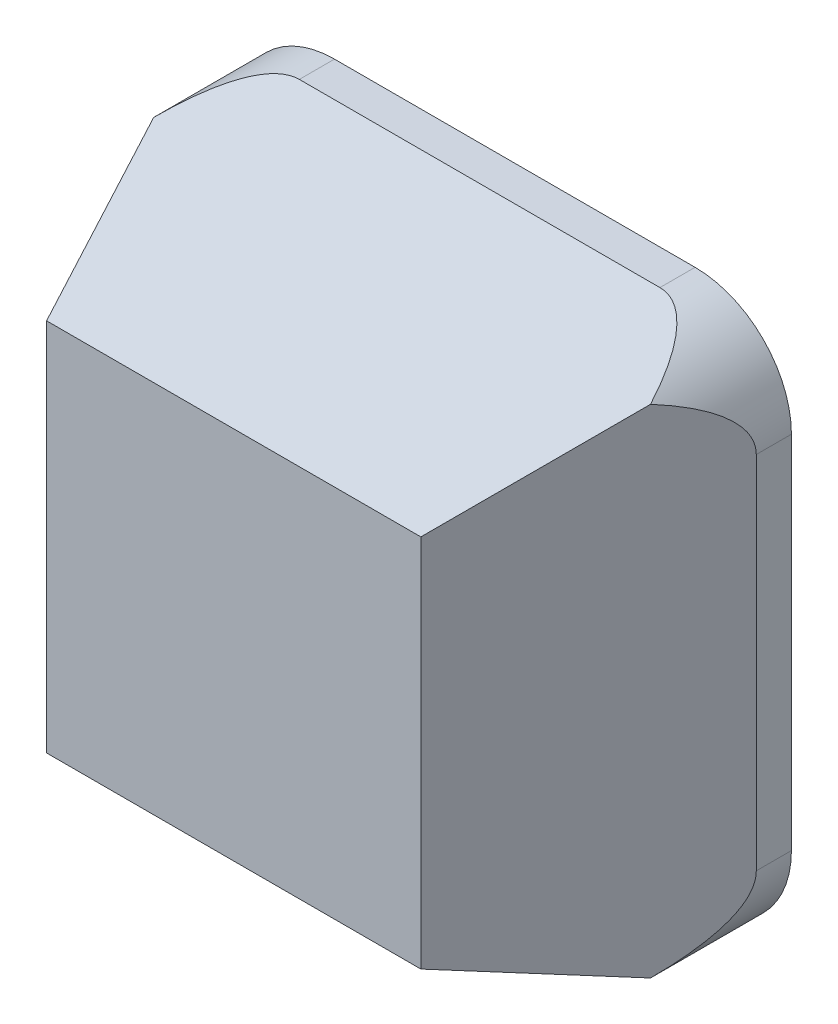
ISO-10303-21;
HEADER;
FILE_DESCRIPTION(('STEP AP214'),'2;1');
FILE_NAME('part.step','',(''),(''),'','','');
FILE_SCHEMA(('AUTOMOTIVE_DESIGN { 1 0 10303 214 1 1 1 1 }'));
ENDSEC;
DATA;
#1=APPLICATION_CONTEXT('core data for automotive mechanical design processes');
#2=APPLICATION_PROTOCOL_DEFINITION('international standard','automotive_design',2000,#1);
#3=PRODUCT_CONTEXT('',#1,'mechanical');
#4=PRODUCT('Part','Part','',(#3));
#5=PRODUCT_RELATED_PRODUCT_CATEGORY('part','',(#4));
#6=PRODUCT_DEFINITION_FORMATION('','',#4);
#7=PRODUCT_DEFINITION_CONTEXT('part definition',#1,'design');
#8=PRODUCT_DEFINITION('design','',#6,#7);
#9=PRODUCT_DEFINITION_SHAPE('','',#8);
#10=(LENGTH_UNIT() NAMED_UNIT(*) SI_UNIT(.MILLI.,.METRE.));
#11=(NAMED_UNIT(*) PLANE_ANGLE_UNIT() SI_UNIT($,.RADIAN.));
#12=(NAMED_UNIT(*) SI_UNIT($,.STERADIAN.) SOLID_ANGLE_UNIT());
#13=UNCERTAINTY_MEASURE_WITH_UNIT(LENGTH_MEASURE(1.E-05),#10,'distance_accuracy_value','');
#14=(GEOMETRIC_REPRESENTATION_CONTEXT(3) GLOBAL_UNCERTAINTY_ASSIGNED_CONTEXT((#13)) GLOBAL_UNIT_ASSIGNED_CONTEXT((#10,
#11,#12)) REPRESENTATION_CONTEXT('',''));
#15=CARTESIAN_POINT('',(0.,0.,0.));
#16=DIRECTION('',(0.,0.,1.));
#17=DIRECTION('',(1.,0.,0.));
#18=AXIS2_PLACEMENT_3D('',#15,#16,#17);
#19=CARTESIAN_POINT('',(8.14635413914787,8.14635413914787,12.7));
#20=DIRECTION('',(0.,0.,-1.));
#21=DIRECTION('',(-1.,0.,0.));
#22=AXIS2_PLACEMENT_3D('',#19,#20,#21);
#23=CYLINDRICAL_SURFACE('',#22,4.35431549252289);
#24=CARTESIAN_POINT('',(8.14635413914787,8.14635413914787,13.5508834928882));
#25=DIRECTION('',(0.,0.939692620785909,0.342020143325666));
#26=DIRECTION('',(0.,0.342020143325666,-0.939692620785909));
#27=AXIS2_PLACEMENT_3D('',#24,#25,#26);
#28=ELLIPSE('',#27,12.7311667967368,4.35431549252289);
#29=CARTESIAN_POINT('',(11.2253201513342,11.2253201513387,5.09149389912564));
#30=VERTEX_POINT('',#29);
#31=CARTESIAN_POINT('',(8.14635413914787,12.5006696316708,1.5875));
#32=VERTEX_POINT('',#31);
#33=EDGE_CURVE('E214',#30,#32,#28,.T.);
#34=ORIENTED_EDGE('',*,*,#33,.F.);
#35=CARTESIAN_POINT('',(8.14635413914787,8.14635413914787,13.5508834928718));
#36=DIRECTION('',(-0.939692620785854,0.,-0.342020143325818));
#37=DIRECTION('',(0.342020143325818,0.,-0.939692620785854));
#38=AXIS2_PLACEMENT_3D('',#35,#36,#37);
#39=ELLIPSE('',#38,12.7311667967312,4.35431549252289);
#40=CARTESIAN_POINT('',(12.500669631667,8.14635413914787,1.58749999999998));
#41=VERTEX_POINT('',#40);
#42=EDGE_CURVE('E237',#30,#41,#39,.T.);
#43=ORIENTED_EDGE('',*,*,#42,.T.);
#44=DIRECTION('',(0.,0.,-1.));
#45=VECTOR('',#44,1.);
#46=CARTESIAN_POINT('',(12.5006696316708,8.14635413914787,12.7));
#47=LINE('',#46,#45);
#48=CARTESIAN_POINT('',(12.5006696316708,8.14635413914787,0.));
#49=VERTEX_POINT('',#48);
#50=EDGE_CURVE('E135',#41,#49,#47,.T.);
#51=ORIENTED_EDGE('',*,*,#50,.T.);
#52=CARTESIAN_POINT('',(8.14635413914787,8.14635413914787,0.));
#53=DIRECTION('',(0.,0.,1.));
#54=DIRECTION('',(1.,0.,0.));
#55=AXIS2_PLACEMENT_3D('',#52,#53,#54);
#56=CIRCLE('',#55,4.35431549252289);
#57=CARTESIAN_POINT('',(8.14635413914787,12.5006696316708,0.));
#58=VERTEX_POINT('',#57);
#59=EDGE_CURVE('E196',#49,#58,#56,.T.);
#60=ORIENTED_EDGE('',*,*,#59,.T.);
#61=DIRECTION('',(0.,0.,-1.));
#62=VECTOR('',#61,1.);
#63=CARTESIAN_POINT('',(8.14635413914787,12.5006696316708,12.7));
#64=LINE('',#63,#62);
#65=EDGE_CURVE('E145',#32,#58,#64,.T.);
#66=ORIENTED_EDGE('',*,*,#65,.F.);
#67=EDGE_LOOP('',(#34,#43,#51,#60,#66));
#68=FACE_BOUND('',#67,.T.);
#69=ADVANCED_FACE('F33',(#68),#23,.T.);
#70=CARTESIAN_POINT('',(0.,12.5006696316708,12.7));
#71=DIRECTION('',(0.,-1.,0.));
#72=DIRECTION('',(1.,0.,0.));
#73=AXIS2_PLACEMENT_3D('',#70,#71,#72);
#74=PLANE('',#73);
#75=DIRECTION('',(1.,0.,0.));
#76=VECTOR('',#75,1.);
#77=CARTESIAN_POINT('',(-25.4,12.5006696316708,1.5875));
#78=LINE('',#77,#76);
#79=CARTESIAN_POINT('',(-8.14635413914787,12.5006696316708,1.5875));
#80=VERTEX_POINT('',#79);
#81=EDGE_CURVE('E192',#80,#32,#78,.T.);
#82=ORIENTED_EDGE('',*,*,#81,.T.);
#83=ORIENTED_EDGE('',*,*,#65,.T.);
#84=DIRECTION('',(-1.,0.,0.));
#85=VECTOR('',#84,1.);
#86=CARTESIAN_POINT('',(0.,12.5006696316708,0.));
#87=LINE('',#86,#85);
#88=CARTESIAN_POINT('',(-8.14635413914787,12.5006696316708,0.));
#89=VERTEX_POINT('',#88);
#90=EDGE_CURVE('E190',#58,#89,#87,.T.);
#91=ORIENTED_EDGE('',*,*,#90,.T.);
#92=DIRECTION('',(0.,0.,-1.));
#93=VECTOR('',#92,1.);
#94=CARTESIAN_POINT('',(-8.14635413914787,12.5006696316708,12.7));
#95=LINE('',#94,#93);
#96=EDGE_CURVE('E181',#80,#89,#95,.T.);
#97=ORIENTED_EDGE('',*,*,#96,.F.);
#98=EDGE_LOOP('',(#82,#83,#91,#97));
#99=FACE_BOUND('',#98,.T.);
#100=ADVANCED_FACE('F187',(#99),#74,.F.);
#101=CARTESIAN_POINT('',(-8.14635413914787,8.14635413914787,12.7));
#102=DIRECTION('',(0.,0.,-1.));
#103=DIRECTION('',(-1.,0.,0.));
#104=AXIS2_PLACEMENT_3D('',#101,#102,#103);
#105=CYLINDRICAL_SURFACE('',#104,4.35431549252289);
#106=DIRECTION('',(0.,0.,-1.));
#107=VECTOR('',#106,1.);
#108=CARTESIAN_POINT('',(-12.5006696316708,8.14635413914787,12.7));
#109=LINE('',#108,#107);
#110=CARTESIAN_POINT('',(-12.500669631667,8.14635413914787,1.58749999999998));
#111=VERTEX_POINT('',#110);
#112=CARTESIAN_POINT('',(-12.5006696316708,8.14635413914787,0.));
#113=VERTEX_POINT('',#112);
#114=EDGE_CURVE('E174',#111,#113,#109,.T.);
#115=ORIENTED_EDGE('',*,*,#114,.F.);
#116=CARTESIAN_POINT('',(-8.14635413914787,8.14635413914787,13.5508834928718));
#117=DIRECTION('',(0.939692620785855,0.,-0.342020143325817));
#118=DIRECTION('',(-0.342020143325817,0.,-0.939692620785854));
#119=AXIS2_PLACEMENT_3D('',#116,#117,#118);
#120=ELLIPSE('',#119,12.7311667967312,4.35431549252289);
#121=CARTESIAN_POINT('',(-11.2253201513342,11.2253201513387,5.09149389912566));
#122=VERTEX_POINT('',#121);
#123=EDGE_CURVE('E227',#111,#122,#120,.T.);
#124=ORIENTED_EDGE('',*,*,#123,.T.);
#125=CARTESIAN_POINT('',(-8.14635413914787,8.14635413914787,13.5508834928882));
#126=DIRECTION('',(0.,0.939692620785909,0.342020143325666));
#127=DIRECTION('',(0.,0.342020143325666,-0.939692620785909));
#128=AXIS2_PLACEMENT_3D('',#125,#126,#127);
#129=ELLIPSE('',#128,12.7311667967368,4.35431549252289);
#130=EDGE_CURVE('E217',#80,#122,#129,.T.);
#131=ORIENTED_EDGE('',*,*,#130,.F.);
#132=ORIENTED_EDGE('',*,*,#96,.T.);
#133=CARTESIAN_POINT('',(-8.14635413914787,8.14635413914787,0.));
#134=DIRECTION('',(0.,0.,1.));
#135=DIRECTION('',(1.,0.,0.));
#136=AXIS2_PLACEMENT_3D('',#133,#134,#135);
#137=CIRCLE('',#136,4.35431549252289);
#138=EDGE_CURVE('E203',#89,#113,#137,.T.);
#139=ORIENTED_EDGE('',*,*,#138,.T.);
#140=EDGE_LOOP('',(#115,#124,#131,#132,#139));
#141=FACE_BOUND('',#140,.T.);
#142=ADVANCED_FACE('F251',(#141),#105,.T.);
#143=CARTESIAN_POINT('',(0.,0.,12.7));
#144=DIRECTION('',(0.,0.,1.));
#145=DIRECTION('',(1.,0.,0.));
#146=AXIS2_PLACEMENT_3D('',#143,#144,#145);
#147=PLANE('',#146);
#148=DIRECTION('',(0.,1.,0.));
#149=VECTOR('',#148,1.);
#150=CARTESIAN_POINT('',(8.4560504033818,-25.4,12.7));
#151=LINE('',#150,#149);
#152=CARTESIAN_POINT('',(8.4560504033818,-8.45605040338761,12.7));
#153=VERTEX_POINT('',#152);
#154=CARTESIAN_POINT('',(8.45605040338179,8.45605040338761,12.7));
#155=VERTEX_POINT('',#154);
#156=EDGE_CURVE('E48',#153,#155,#151,.T.);
#157=ORIENTED_EDGE('',*,*,#156,.T.);
#158=DIRECTION('',(-1.,0.,0.));
#159=VECTOR('',#158,1.);
#160=CARTESIAN_POINT('',(0.,8.45605040338762,12.7));
#161=LINE('',#160,#159);
#162=CARTESIAN_POINT('',(-8.45605040338181,8.45605040338761,12.7));
#163=VERTEX_POINT('',#162);
#164=EDGE_CURVE('E143',#155,#163,#161,.T.);
#165=ORIENTED_EDGE('',*,*,#164,.T.);
#166=DIRECTION('',(0.,1.,0.));
#167=VECTOR('',#166,1.);
#168=CARTESIAN_POINT('',(-8.45605040338181,-25.4,12.7));
#169=LINE('',#168,#167);
#170=CARTESIAN_POINT('',(-8.45605040338181,-8.45605040338761,12.7));
#171=VERTEX_POINT('',#170);
#172=EDGE_CURVE('E235',#171,#163,#169,.T.);
#173=ORIENTED_EDGE('',*,*,#172,.F.);
#174=DIRECTION('',(1.,0.,0.));
#175=VECTOR('',#174,1.);
#176=CARTESIAN_POINT('',(-25.4,-8.45605040338761,12.7));
#177=LINE('',#176,#175);
#178=EDGE_CURVE('E158',#171,#153,#177,.T.);
#179=ORIENTED_EDGE('',*,*,#178,.T.);
#180=EDGE_LOOP('',(#157,#165,#173,#179));
#181=FACE_BOUND('',#180,.T.);
#182=ADVANCED_FACE('F243',(#181),#147,.T.);
#183=CARTESIAN_POINT('',(0.,-12.5006696316708,12.7));
#184=DIRECTION('',(0.,1.,0.));
#185=DIRECTION('',(-1.,0.,0.));
#186=AXIS2_PLACEMENT_3D('',#183,#184,#185);
#187=PLANE('',#186);
#188=DIRECTION('',(0.,0.,-1.));
#189=VECTOR('',#188,1.);
#190=CARTESIAN_POINT('',(8.14635413914787,-12.5006696316707,12.7));
#191=LINE('',#190,#189);
#192=CARTESIAN_POINT('',(8.14635413914787,-12.5006696316708,1.58749999999998));
#193=VERTEX_POINT('',#192);
#194=CARTESIAN_POINT('',(8.14635413914787,-12.5006696316707,0.));
#195=VERTEX_POINT('',#194);
#196=EDGE_CURVE('E141',#193,#195,#191,.T.);
#197=ORIENTED_EDGE('',*,*,#196,.F.);
#198=DIRECTION('',(1.,0.,0.));
#199=VECTOR('',#198,1.);
#200=CARTESIAN_POINT('',(-25.4,-12.5006696316707,1.5875));
#201=LINE('',#200,#199);
#202=CARTESIAN_POINT('',(-8.14635413914786,-12.5006696316707,1.58749999999999));
#203=VERTEX_POINT('',#202);
#204=EDGE_CURVE('E225',#203,#193,#201,.T.);
#205=ORIENTED_EDGE('',*,*,#204,.F.);
#206=DIRECTION('',(0.,0.,-1.));
#207=VECTOR('',#206,1.);
#208=CARTESIAN_POINT('',(-8.14635413914787,-12.5006696316708,12.7));
#209=LINE('',#208,#207);
#210=CARTESIAN_POINT('',(-8.14635413914787,-12.5006696316708,0.));
#211=VERTEX_POINT('',#210);
#212=EDGE_CURVE('E166',#203,#211,#209,.T.);
#213=ORIENTED_EDGE('',*,*,#212,.T.);
#214=DIRECTION('',(1.,0.,0.));
#215=VECTOR('',#214,1.);
#216=CARTESIAN_POINT('',(0.,-12.5006696316708,0.));
#217=LINE('',#216,#215);
#218=EDGE_CURVE('E212',#211,#195,#217,.T.);
#219=ORIENTED_EDGE('',*,*,#218,.T.);
#220=EDGE_LOOP('',(#197,#205,#213,#219));
#221=FACE_BOUND('',#220,.T.);
#222=ADVANCED_FACE('F35',(#221),#187,.F.);
#223=CARTESIAN_POINT('',(8.14635413914787,-8.14635413914787,12.7));
#224=DIRECTION('',(0.,0.,-1.));
#225=DIRECTION('',(-1.,0.,0.));
#226=AXIS2_PLACEMENT_3D('',#223,#224,#225);
#227=CYLINDRICAL_SURFACE('',#226,4.35431549252289);
#228=DIRECTION('',(0.,0.,-1.));
#229=VECTOR('',#228,1.);
#230=CARTESIAN_POINT('',(12.5006696316708,-8.14635413914787,12.7));
#231=LINE('',#230,#229);
#232=CARTESIAN_POINT('',(12.500669631667,-8.14635413914787,1.58749999999998));
#233=VERTEX_POINT('',#232);
#234=CARTESIAN_POINT('',(12.5006696316708,-8.14635413914787,0.));
#235=VERTEX_POINT('',#234);
#236=EDGE_CURVE('E133',#233,#235,#231,.T.);
#237=ORIENTED_EDGE('',*,*,#236,.F.);
#238=CARTESIAN_POINT('',(8.14635413914787,-8.14635413914787,13.5508834928718));
#239=DIRECTION('',(-0.939692620785854,0.,-0.342020143325818));
#240=DIRECTION('',(0.342020143325818,0.,-0.939692620785854));
#241=AXIS2_PLACEMENT_3D('',#238,#239,#240);
#242=ELLIPSE('',#241,12.7311667967312,4.35431549252289);
#243=CARTESIAN_POINT('',(11.2253201513342,-11.2253201513387,5.09149389912564));
#244=VERTEX_POINT('',#243);
#245=EDGE_CURVE('E119',#233,#244,#242,.T.);
#246=ORIENTED_EDGE('',*,*,#245,.T.);
#247=CARTESIAN_POINT('',(8.14635413914787,-8.14635413914787,13.5508834928882));
#248=DIRECTION('',(0.,0.939692620785909,-0.342020143325666));
#249=DIRECTION('',(0.,-0.342020143325666,-0.93969262078591));
#250=AXIS2_PLACEMENT_3D('',#247,#248,#249);
#251=ELLIPSE('',#250,12.7311667967368,4.35431549252289);
#252=EDGE_CURVE('E223',#244,#193,#251,.T.);
#253=ORIENTED_EDGE('',*,*,#252,.T.);
#254=ORIENTED_EDGE('',*,*,#196,.T.);
#255=CARTESIAN_POINT('',(8.14635413914787,-8.14635413914787,0.));
#256=DIRECTION('',(0.,0.,1.));
#257=DIRECTION('',(1.,0.,0.));
#258=AXIS2_PLACEMENT_3D('',#255,#256,#257);
#259=CIRCLE('',#258,4.35431549252289);
#260=EDGE_CURVE('E139',#195,#235,#259,.T.);
#261=ORIENTED_EDGE('',*,*,#260,.T.);
#262=EDGE_LOOP('',(#237,#246,#253,#254,#261));
#263=FACE_BOUND('',#262,.T.);
#264=ADVANCED_FACE('F137',(#263),#227,.T.);
#265=CARTESIAN_POINT('',(12.5006696316708,0.,12.7));
#266=DIRECTION('',(-1.,0.,0.));
#267=DIRECTION('',(0.,-1.,0.));
#268=AXIS2_PLACEMENT_3D('',#265,#266,#267);
#269=PLANE('',#268);
#270=ORIENTED_EDGE('',*,*,#50,.F.);
#271=DIRECTION('',(0.,1.,0.));
#272=VECTOR('',#271,1.);
#273=CARTESIAN_POINT('',(12.500669631667,-25.4,1.58749999999998));
#274=LINE('',#273,#272);
#275=EDGE_CURVE('E122',#233,#41,#274,.T.);
#276=ORIENTED_EDGE('',*,*,#275,.F.);
#277=ORIENTED_EDGE('',*,*,#236,.T.);
#278=DIRECTION('',(0.,1.,0.));
#279=VECTOR('',#278,1.);
#280=CARTESIAN_POINT('',(12.5006696316708,0.,0.));
#281=LINE('',#280,#279);
#282=EDGE_CURVE('E198',#235,#49,#281,.T.);
#283=ORIENTED_EDGE('',*,*,#282,.T.);
#284=EDGE_LOOP('',(#270,#276,#277,#283));
#285=FACE_BOUND('',#284,.T.);
#286=ADVANCED_FACE('F131',(#285),#269,.F.);
#287=CARTESIAN_POINT('',(-12.5006696316708,0.,12.7));
#288=DIRECTION('',(1.,0.,0.));
#289=DIRECTION('',(0.,1.,0.));
#290=AXIS2_PLACEMENT_3D('',#287,#288,#289);
#291=PLANE('',#290);
#292=DIRECTION('',(0.,0.,-1.));
#293=VECTOR('',#292,1.);
#294=CARTESIAN_POINT('',(-12.5006696316707,-8.14635413914787,12.7));
#295=LINE('',#294,#293);
#296=CARTESIAN_POINT('',(-12.5006696316707,-8.14635413914787,1.58749999998961));
#297=VERTEX_POINT('',#296);
#298=CARTESIAN_POINT('',(-12.5006696316707,-8.14635413914787,0.));
#299=VERTEX_POINT('',#298);
#300=EDGE_CURVE('E172',#297,#299,#295,.T.);
#301=ORIENTED_EDGE('',*,*,#300,.F.);
#302=DIRECTION('',(0.,1.,0.));
#303=VECTOR('',#302,1.);
#304=CARTESIAN_POINT('',(-12.500669631667,-25.4,1.58749999999998));
#305=LINE('',#304,#303);
#306=EDGE_CURVE('E234',#297,#111,#305,.T.);
#307=ORIENTED_EDGE('',*,*,#306,.T.);
#308=ORIENTED_EDGE('',*,*,#114,.T.);
#309=DIRECTION('',(0.,-1.,0.));
#310=VECTOR('',#309,1.);
#311=CARTESIAN_POINT('',(-12.5006696316708,0.,0.));
#312=LINE('',#311,#310);
#313=EDGE_CURVE('E176',#113,#299,#312,.T.);
#314=ORIENTED_EDGE('',*,*,#313,.T.);
#315=EDGE_LOOP('',(#301,#307,#308,#314));
#316=FACE_BOUND('',#315,.T.);
#317=ADVANCED_FACE('F209',(#316),#291,.F.);
#318=CARTESIAN_POINT('',(-8.14635413914786,-8.14635413914787,12.7));
#319=DIRECTION('',(0.,0.,-1.));
#320=DIRECTION('',(-1.,0.,0.));
#321=AXIS2_PLACEMENT_3D('',#318,#319,#320);
#322=CYLINDRICAL_SURFACE('',#321,4.35431549252288);
#323=CARTESIAN_POINT('',(-8.14635413914786,-8.14635413914787,13.5508834928882));
#324=DIRECTION('',(0.,0.939692620785909,-0.342020143325666));
#325=DIRECTION('',(0.,-0.342020143325666,-0.93969262078591));
#326=AXIS2_PLACEMENT_3D('',#323,#324,#325);
#327=ELLIPSE('',#326,12.7311667967368,4.35431549252288);
#328=CARTESIAN_POINT('',(-11.2253201513342,-11.2253201513386,5.09149389912567));
#329=VERTEX_POINT('',#328);
#330=EDGE_CURVE('E150',#203,#329,#327,.T.);
#331=ORIENTED_EDGE('',*,*,#330,.T.);
#332=CARTESIAN_POINT('',(-8.14635413914786,-8.14635413914787,13.5508834928718));
#333=DIRECTION('',(0.939692620785855,0.,-0.342020143325817));
#334=DIRECTION('',(-0.342020143325817,0.,-0.939692620785854));
#335=AXIS2_PLACEMENT_3D('',#332,#333,#334);
#336=ELLIPSE('',#335,12.7311667967312,4.35431549252288);
#337=EDGE_CURVE('E55',#329,#297,#336,.T.);
#338=ORIENTED_EDGE('',*,*,#337,.T.);
#339=ORIENTED_EDGE('',*,*,#300,.T.);
#340=CARTESIAN_POINT('',(-8.14635413914786,-8.14635413914787,0.));
#341=DIRECTION('',(0.,0.,1.));
#342=DIRECTION('',(1.,0.,0.));
#343=AXIS2_PLACEMENT_3D('',#340,#341,#342);
#344=CIRCLE('',#343,4.35431549252288);
#345=EDGE_CURVE('E168',#299,#211,#344,.T.);
#346=ORIENTED_EDGE('',*,*,#345,.T.);
#347=ORIENTED_EDGE('',*,*,#212,.F.);
#348=EDGE_LOOP('',(#331,#338,#339,#346,#347));
#349=FACE_BOUND('',#348,.T.);
#350=ADVANCED_FACE('F163',(#349),#322,.T.);
#351=CARTESIAN_POINT('',(0.,0.,0.));
#352=DIRECTION('',(0.,0.,1.));
#353=DIRECTION('',(1.,0.,0.));
#354=AXIS2_PLACEMENT_3D('',#351,#352,#353);
#355=PLANE('',#354);
#356=ORIENTED_EDGE('',*,*,#218,.F.);
#357=ORIENTED_EDGE('',*,*,#345,.F.);
#358=ORIENTED_EDGE('',*,*,#313,.F.);
#359=ORIENTED_EDGE('',*,*,#138,.F.);
#360=ORIENTED_EDGE('',*,*,#90,.F.);
#361=ORIENTED_EDGE('',*,*,#59,.F.);
#362=ORIENTED_EDGE('',*,*,#282,.F.);
#363=ORIENTED_EDGE('',*,*,#260,.F.);
#364=EDGE_LOOP('',(#356,#357,#358,#359,#360,#361,#362,#363));
#365=FACE_BOUND('',#364,.T.);
#366=ADVANCED_FACE('F200',(#365),#355,.F.);
#367=CARTESIAN_POINT('',(-25.4,11.5485817343279,4.20333999928566));
#368=DIRECTION('',(0.,0.939692620785909,0.342020143325666));
#369=DIRECTION('',(0.,-0.342020143325666,0.939692620785909));
#370=AXIS2_PLACEMENT_3D('',#367,#368,#369);
#371=PLANE('',#370);
#372=DIRECTION('',(-0.323615577118328,-0.323615577118166,0.889126490715943));
#373=VECTOR('',#372,1.);
#374=CARTESIAN_POINT('',(7.67906607229572,7.67906607230194,14.834746904928));
#375=LINE('',#374,#373);
#376=EDGE_CURVE('E127',#30,#155,#375,.T.);
#377=ORIENTED_EDGE('',*,*,#376,.F.);
#378=ORIENTED_EDGE('',*,*,#33,.T.);
#379=ORIENTED_EDGE('',*,*,#81,.F.);
#380=ORIENTED_EDGE('',*,*,#130,.T.);
#381=DIRECTION('',(-0.323615577118327,0.323615577118166,-0.889126490715943));
#382=VECTOR('',#381,1.);
#383=CARTESIAN_POINT('',(-12.99919979338,12.9991997933836,0.217799637776911));
#384=LINE('',#383,#382);
#385=EDGE_CURVE('E231',#163,#122,#384,.T.);
#386=ORIENTED_EDGE('',*,*,#385,.F.);
#387=ORIENTED_EDGE('',*,*,#164,.F.);
#388=EDGE_LOOP('',(#377,#378,#379,#380,#386,#387));
#389=FACE_BOUND('',#388,.T.);
#390=ADVANCED_FACE('F247',(#389),#371,.T.);
#391=CARTESIAN_POINT('',(-25.4,-12.5006696316707,1.5875));
#392=DIRECTION('',(0.,0.939692620785909,-0.342020143325666));
#393=DIRECTION('',(0.,0.342020143325666,0.93969262078591));
#394=AXIS2_PLACEMENT_3D('',#391,#392,#393);
#395=PLANE('',#394);
#396=ORIENTED_EDGE('',*,*,#252,.F.);
#397=DIRECTION('',(-0.323615577118328,0.323615577118165,0.889126490715943));
#398=VECTOR('',#397,1.);
#399=CARTESIAN_POINT('',(8.5314446206609,-8.53144462066668,12.4928560904683));
#400=LINE('',#399,#398);
#401=EDGE_CURVE('E11',#244,#153,#400,.T.);
#402=ORIENTED_EDGE('',*,*,#401,.T.);
#403=ORIENTED_EDGE('',*,*,#178,.F.);
#404=DIRECTION('',(-0.323615577118327,-0.323615577118165,-0.889126490715944));
#405=VECTOR('',#404,1.);
#406=CARTESIAN_POINT('',(-13.8515783417452,-13.8515783417483,-2.12409117668276));
#407=LINE('',#406,#405);
#408=EDGE_CURVE('E41',#171,#329,#407,.T.);
#409=ORIENTED_EDGE('',*,*,#408,.T.);
#410=ORIENTED_EDGE('',*,*,#330,.F.);
#411=ORIENTED_EDGE('',*,*,#204,.T.);
#412=EDGE_LOOP('',(#396,#402,#403,#409,#410,#411));
#413=FACE_BOUND('',#412,.T.);
#414=ADVANCED_FACE('F154',(#413),#395,.F.);
#415=CARTESIAN_POINT('',(-12.500669631667,-25.4,1.58749999999998));
#416=DIRECTION('',(0.939692620785855,0.,-0.342020143325817));
#417=DIRECTION('',(-0.342020143325817,0.,-0.939692620785854));
#418=AXIS2_PLACEMENT_3D('',#415,#416,#417);
#419=PLANE('',#418);
#420=ORIENTED_EDGE('',*,*,#306,.F.);
#421=ORIENTED_EDGE('',*,*,#337,.F.);
#422=ORIENTED_EDGE('',*,*,#408,.F.);
#423=ORIENTED_EDGE('',*,*,#172,.T.);
#424=ORIENTED_EDGE('',*,*,#385,.T.);
#425=ORIENTED_EDGE('',*,*,#123,.F.);
#426=EDGE_LOOP('',(#420,#421,#422,#423,#424,#425));
#427=FACE_BOUND('',#426,.T.);
#428=ADVANCED_FACE('F249',(#427),#419,.F.);
#429=CARTESIAN_POINT('',(12.500669631667,-25.4,1.58749999999998));
#430=DIRECTION('',(-0.939692620785854,0.,-0.342020143325818));
#431=DIRECTION('',(-0.342020143325818,0.,0.939692620785854));
#432=AXIS2_PLACEMENT_3D('',#429,#430,#431);
#433=PLANE('',#432);
#434=ORIENTED_EDGE('',*,*,#376,.T.);
#435=ORIENTED_EDGE('',*,*,#156,.F.);
#436=ORIENTED_EDGE('',*,*,#401,.F.);
#437=ORIENTED_EDGE('',*,*,#245,.F.);
#438=ORIENTED_EDGE('',*,*,#275,.T.);
#439=ORIENTED_EDGE('',*,*,#42,.F.);
#440=EDGE_LOOP('',(#434,#435,#436,#437,#438,#439));
#441=FACE_BOUND('',#440,.T.);
#442=ADVANCED_FACE('F121',(#441),#433,.F.);
#443=CLOSED_SHELL('',(#69,#100,#142,#182,#222,#264,#286,#317,#350,#366,#390,#414,#428,#442));
#444=MANIFOLD_SOLID_BREP('B2',#443);
#445=ADVANCED_BREP_SHAPE_REPRESENTATION('',(#18,#444),#14);
#446=SHAPE_DEFINITION_REPRESENTATION(#9,#445);
ENDSEC;
END-ISO-10303-21;
